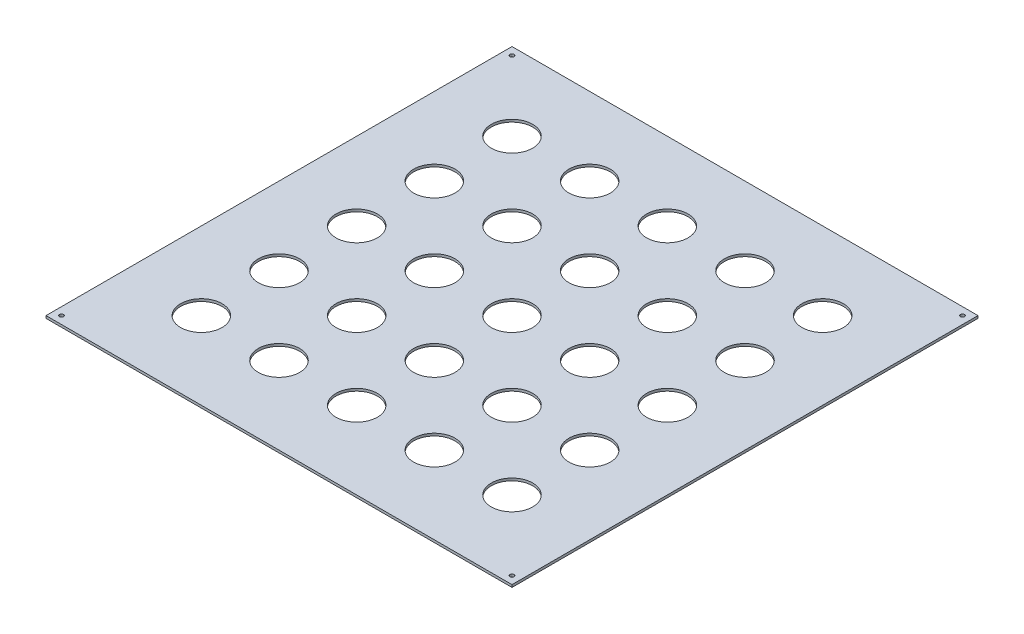
ISO-10303-21;
HEADER;
FILE_DESCRIPTION(('STEP AP214'),'2;1');
FILE_NAME('part.step','',(''),(''),'','','');
FILE_SCHEMA(('AUTOMOTIVE_DESIGN { 1 0 10303 214 1 1 1 1 }'));
ENDSEC;
DATA;
#1=APPLICATION_CONTEXT('core data for automotive mechanical design processes');
#2=APPLICATION_PROTOCOL_DEFINITION('international standard','automotive_design',2000,#1);
#3=PRODUCT_CONTEXT('',#1,'mechanical');
#4=PRODUCT('Part','Part','',(#3));
#5=PRODUCT_RELATED_PRODUCT_CATEGORY('part','',(#4));
#6=PRODUCT_DEFINITION_FORMATION('','',#4);
#7=PRODUCT_DEFINITION_CONTEXT('part definition',#1,'design');
#8=PRODUCT_DEFINITION('design','',#6,#7);
#9=PRODUCT_DEFINITION_SHAPE('','',#8);
#10=(LENGTH_UNIT() NAMED_UNIT(*) SI_UNIT(.MILLI.,.METRE.));
#11=(NAMED_UNIT(*) PLANE_ANGLE_UNIT() SI_UNIT($,.RADIAN.));
#12=(NAMED_UNIT(*) SI_UNIT($,.STERADIAN.) SOLID_ANGLE_UNIT());
#13=UNCERTAINTY_MEASURE_WITH_UNIT(LENGTH_MEASURE(1.E-05),#10,'distance_accuracy_value','');
#14=(GEOMETRIC_REPRESENTATION_CONTEXT(3) GLOBAL_UNCERTAINTY_ASSIGNED_CONTEXT((#13)) GLOBAL_UNIT_ASSIGNED_CONTEXT((#10,
#11,#12)) REPRESENTATION_CONTEXT('',''));
#15=CARTESIAN_POINT('',(0.,0.,0.));
#16=DIRECTION('',(0.,0.,1.));
#17=DIRECTION('',(1.,0.,0.));
#18=AXIS2_PLACEMENT_3D('',#15,#16,#17);
#19=CARTESIAN_POINT('',(300.000000000012,-1.5875,300.));
#20=DIRECTION('',(1.,0.,0.));
#21=DIRECTION('',(0.,0.,-1.));
#22=AXIS2_PLACEMENT_3D('',#19,#20,#21);
#23=PLANE('',#22);
#24=DIRECTION('',(0.,1.,0.));
#25=VECTOR('',#24,1.);
#26=CARTESIAN_POINT('',(300.000000000011,-1.5875,-300.));
#27=LINE('',#26,#25);
#28=CARTESIAN_POINT('',(300.000000000011,-1.5875,-300.));
#29=VERTEX_POINT('',#28);
#30=CARTESIAN_POINT('',(300.000000000011,1.5875,-300.));
#31=VERTEX_POINT('',#30);
#32=EDGE_CURVE('E36',#29,#31,#27,.T.);
#33=ORIENTED_EDGE('',*,*,#32,.T.);
#34=DIRECTION('',(0.,0.,-1.));
#35=VECTOR('',#34,1.);
#36=CARTESIAN_POINT('',(300.000000000012,1.5875,300.));
#37=LINE('',#36,#35);
#38=CARTESIAN_POINT('',(300.000000000012,1.5875,300.));
#39=VERTEX_POINT('',#38);
#40=EDGE_CURVE('E73',#39,#31,#37,.T.);
#41=ORIENTED_EDGE('',*,*,#40,.F.);
#42=DIRECTION('',(0.,1.,0.));
#43=VECTOR('',#42,1.);
#44=CARTESIAN_POINT('',(300.000000000012,-1.5875,300.));
#45=LINE('',#44,#43);
#46=CARTESIAN_POINT('',(300.000000000012,-1.5875,300.));
#47=VERTEX_POINT('',#46);
#48=EDGE_CURVE('E11',#47,#39,#45,.T.);
#49=ORIENTED_EDGE('',*,*,#48,.F.);
#50=DIRECTION('',(0.,0.,-1.));
#51=VECTOR('',#50,1.);
#52=CARTESIAN_POINT('',(300.000000000012,-1.5875,300.));
#53=LINE('',#52,#51);
#54=EDGE_CURVE('E74',#47,#29,#53,.T.);
#55=ORIENTED_EDGE('',*,*,#54,.T.);
#56=EDGE_LOOP('',(#33,#41,#49,#55));
#57=FACE_BOUND('',#56,.T.);
#58=ADVANCED_FACE('F33',(#57),#23,.T.);
#59=CARTESIAN_POINT('',(-300.000000000011,-1.5875,300.));
#60=DIRECTION('',(0.,0.,1.));
#61=DIRECTION('',(1.,0.,0.));
#62=AXIS2_PLACEMENT_3D('',#59,#60,#61);
#63=PLANE('',#62);
#64=ORIENTED_EDGE('',*,*,#48,.T.);
#65=DIRECTION('',(1.,0.,0.));
#66=VECTOR('',#65,1.);
#67=CARTESIAN_POINT('',(-300.000000000011,1.5875,300.));
#68=LINE('',#67,#66);
#69=CARTESIAN_POINT('',(-300.000000000011,1.5875,300.));
#70=VERTEX_POINT('',#69);
#71=EDGE_CURVE('E91',#70,#39,#68,.T.);
#72=ORIENTED_EDGE('',*,*,#71,.F.);
#73=DIRECTION('',(0.,1.,0.));
#74=VECTOR('',#73,1.);
#75=CARTESIAN_POINT('',(-300.000000000011,-1.5875,300.));
#76=LINE('',#75,#74);
#77=CARTESIAN_POINT('',(-300.000000000011,-1.5875,300.));
#78=VERTEX_POINT('',#77);
#79=EDGE_CURVE('E41',#78,#70,#76,.T.);
#80=ORIENTED_EDGE('',*,*,#79,.F.);
#81=DIRECTION('',(1.,0.,0.));
#82=VECTOR('',#81,1.);
#83=CARTESIAN_POINT('',(-300.000000000011,-1.5875,300.));
#84=LINE('',#83,#82);
#85=EDGE_CURVE('E79',#78,#47,#84,.T.);
#86=ORIENTED_EDGE('',*,*,#85,.T.);
#87=EDGE_LOOP('',(#64,#72,#80,#86));
#88=FACE_BOUND('',#87,.T.);
#89=ADVANCED_FACE('F198',(#88),#63,.T.);
#90=CARTESIAN_POINT('',(-300.000000000011,-1.5875,300.));
#91=DIRECTION('',(-1.,0.,0.));
#92=DIRECTION('',(0.,0.,1.));
#93=AXIS2_PLACEMENT_3D('',#90,#91,#92);
#94=PLANE('',#93);
#95=ORIENTED_EDGE('',*,*,#79,.T.);
#96=DIRECTION('',(0.,0.,1.));
#97=VECTOR('',#96,1.);
#98=CARTESIAN_POINT('',(-300.000000000011,1.5875,300.));
#99=LINE('',#98,#97);
#100=CARTESIAN_POINT('',(-300.000000000011,1.5875,-300.));
#101=VERTEX_POINT('',#100);
#102=EDGE_CURVE('E86',#101,#70,#99,.T.);
#103=ORIENTED_EDGE('',*,*,#102,.F.);
#104=DIRECTION('',(0.,1.,0.));
#105=VECTOR('',#104,1.);
#106=CARTESIAN_POINT('',(-300.000000000011,-1.5875,-300.));
#107=LINE('',#106,#105);
#108=CARTESIAN_POINT('',(-300.000000000011,-1.5875,-300.));
#109=VERTEX_POINT('',#108);
#110=EDGE_CURVE('E78',#109,#101,#107,.T.);
#111=ORIENTED_EDGE('',*,*,#110,.F.);
#112=DIRECTION('',(0.,0.,1.));
#113=VECTOR('',#112,1.);
#114=CARTESIAN_POINT('',(-300.000000000011,-1.5875,300.));
#115=LINE('',#114,#113);
#116=EDGE_CURVE('E191',#109,#78,#115,.T.);
#117=ORIENTED_EDGE('',*,*,#116,.T.);
#118=EDGE_LOOP('',(#95,#103,#111,#117));
#119=FACE_BOUND('',#118,.T.);
#120=ADVANCED_FACE('F195',(#119),#94,.T.);
#121=CARTESIAN_POINT('',(-300.000000000011,-1.5875,-300.));
#122=DIRECTION('',(0.,0.,-1.));
#123=DIRECTION('',(-1.,0.,0.));
#124=AXIS2_PLACEMENT_3D('',#121,#122,#123);
#125=PLANE('',#124);
#126=ORIENTED_EDGE('',*,*,#110,.T.);
#127=DIRECTION('',(-1.,0.,0.));
#128=VECTOR('',#127,1.);
#129=CARTESIAN_POINT('',(-300.000000000011,1.5875,-300.));
#130=LINE('',#129,#128);
#131=EDGE_CURVE('E81',#31,#101,#130,.T.);
#132=ORIENTED_EDGE('',*,*,#131,.F.);
#133=ORIENTED_EDGE('',*,*,#32,.F.);
#134=DIRECTION('',(-1.,0.,0.));
#135=VECTOR('',#134,1.);
#136=CARTESIAN_POINT('',(-300.000000000011,-1.5875,-300.));
#137=LINE('',#136,#135);
#138=EDGE_CURVE('E189',#29,#109,#137,.T.);
#139=ORIENTED_EDGE('',*,*,#138,.T.);
#140=EDGE_LOOP('',(#126,#132,#133,#139));
#141=FACE_BOUND('',#140,.T.);
#142=ADVANCED_FACE('F82',(#141),#125,.T.);
#143=CARTESIAN_POINT('',(0.,-1.5875,0.));
#144=DIRECTION('',(0.,-1.,0.));
#145=DIRECTION('',(0.,0.,-1.));
#146=AXIS2_PLACEMENT_3D('',#143,#144,#145);
#147=PLANE('',#146);
#148=CARTESIAN_POINT('',(-99.9999999999994,-1.5875,-99.9999999999999));
#149=DIRECTION('',(0.,1.,0.));
#150=DIRECTION('',(0.,0.,-1.));
#151=AXIS2_PLACEMENT_3D('',#148,#149,#150);
#152=CIRCLE('',#151,26.67);
#153=CARTESIAN_POINT('',(-99.9999999999994,-1.5875,-126.67));
#154=VERTEX_POINT('',#153);
#155=EDGE_CURVE('E101',#154,#154,#152,.T.);
#156=ORIENTED_EDGE('',*,*,#155,.T.);
#157=EDGE_LOOP('',(#156));
#158=FACE_BOUND('',#157,.T.);
#159=CARTESIAN_POINT('',(-199.999999999999,-1.5875,-99.9999999999999));
#160=DIRECTION('',(0.,1.,0.));
#161=DIRECTION('',(0.,0.,-1.));
#162=AXIS2_PLACEMENT_3D('',#159,#160,#161);
#163=CIRCLE('',#162,26.67);
#164=CARTESIAN_POINT('',(-199.999999999999,-1.5875,-126.67));
#165=VERTEX_POINT('',#164);
#166=EDGE_CURVE('E104',#165,#165,#163,.T.);
#167=ORIENTED_EDGE('',*,*,#166,.T.);
#168=EDGE_LOOP('',(#167));
#169=FACE_BOUND('',#168,.T.);
#170=CARTESIAN_POINT('',(-99.9999999999991,-1.5875,-200.));
#171=DIRECTION('',(0.,1.,0.));
#172=DIRECTION('',(0.,0.,-1.));
#173=AXIS2_PLACEMENT_3D('',#170,#171,#172);
#174=CIRCLE('',#173,26.67);
#175=CARTESIAN_POINT('',(-99.9999999999991,-1.5875,-226.67));
#176=VERTEX_POINT('',#175);
#177=EDGE_CURVE('E107',#176,#176,#174,.T.);
#178=ORIENTED_EDGE('',*,*,#177,.T.);
#179=EDGE_LOOP('',(#178));
#180=FACE_BOUND('',#179,.T.);
#181=CARTESIAN_POINT('',(-199.999999999999,-1.5875,-200.));
#182=DIRECTION('',(0.,1.,0.));
#183=DIRECTION('',(0.,0.,-1.));
#184=AXIS2_PLACEMENT_3D('',#181,#182,#183);
#185=CIRCLE('',#184,26.67);
#186=CARTESIAN_POINT('',(-199.999999999999,-1.5875,-226.67));
#187=VERTEX_POINT('',#186);
#188=EDGE_CURVE('E110',#187,#187,#185,.T.);
#189=ORIENTED_EDGE('',*,*,#188,.T.);
#190=EDGE_LOOP('',(#189));
#191=FACE_BOUND('',#190,.T.);
#192=CARTESIAN_POINT('',(99.9999999999994,-1.5875,99.9999999999999));
#193=DIRECTION('',(0.,1.,0.));
#194=DIRECTION('',(0.,0.,-1.));
#195=AXIS2_PLACEMENT_3D('',#192,#193,#194);
#196=CIRCLE('',#195,26.67);
#197=CARTESIAN_POINT('',(99.9999999999994,-1.5875,73.3299999999999));
#198=VERTEX_POINT('',#197);
#199=EDGE_CURVE('E113',#198,#198,#196,.T.);
#200=ORIENTED_EDGE('',*,*,#199,.T.);
#201=EDGE_LOOP('',(#200));
#202=FACE_BOUND('',#201,.T.);
#203=CARTESIAN_POINT('',(199.999999999999,-1.5875,99.9999999999999));
#204=DIRECTION('',(0.,1.,0.));
#205=DIRECTION('',(0.,0.,-1.));
#206=AXIS2_PLACEMENT_3D('',#203,#204,#205);
#207=CIRCLE('',#206,26.67);
#208=CARTESIAN_POINT('',(199.999999999999,-1.5875,73.3299999999999));
#209=VERTEX_POINT('',#208);
#210=EDGE_CURVE('E116',#209,#209,#207,.T.);
#211=ORIENTED_EDGE('',*,*,#210,.T.);
#212=EDGE_LOOP('',(#211));
#213=FACE_BOUND('',#212,.T.);
#214=CARTESIAN_POINT('',(99.9999999999991,-1.5875,200.));
#215=DIRECTION('',(0.,1.,0.));
#216=DIRECTION('',(0.,0.,-1.));
#217=AXIS2_PLACEMENT_3D('',#214,#215,#216);
#218=CIRCLE('',#217,26.67);
#219=CARTESIAN_POINT('',(99.9999999999991,-1.5875,173.33));
#220=VERTEX_POINT('',#219);
#221=EDGE_CURVE('E119',#220,#220,#218,.T.);
#222=ORIENTED_EDGE('',*,*,#221,.T.);
#223=EDGE_LOOP('',(#222));
#224=FACE_BOUND('',#223,.T.);
#225=CARTESIAN_POINT('',(1.87284419838085E-12,-1.5875,200.));
#226=DIRECTION('',(0.,1.,0.));
#227=DIRECTION('',(0.,0.,1.));
#228=AXIS2_PLACEMENT_3D('',#225,#226,#227);
#229=CIRCLE('',#228,26.67);
#230=CARTESIAN_POINT('',(1.87284419838085E-12,-1.5875,226.67));
#231=VERTEX_POINT('',#230);
#232=EDGE_CURVE('E122',#231,#231,#229,.T.);
#233=ORIENTED_EDGE('',*,*,#232,.T.);
#234=EDGE_LOOP('',(#233));
#235=FACE_BOUND('',#234,.T.);
#236=CARTESIAN_POINT('',(8.25399796727909E-13,-1.5875,100.));
#237=DIRECTION('',(0.,1.,0.));
#238=DIRECTION('',(0.,0.,1.));
#239=AXIS2_PLACEMENT_3D('',#236,#237,#238);
#240=CIRCLE('',#239,26.67);
#241=CARTESIAN_POINT('',(8.25399796727909E-13,-1.5875,126.67));
#242=VERTEX_POINT('',#241);
#243=EDGE_CURVE('E125',#242,#242,#240,.T.);
#244=ORIENTED_EDGE('',*,*,#243,.T.);
#245=EDGE_LOOP('',(#244));
#246=FACE_BOUND('',#245,.T.);
#247=CARTESIAN_POINT('',(-199.999999999998,-1.5875,200.000000000002));
#248=DIRECTION('',(0.,1.,0.));
#249=DIRECTION('',(0.,0.,1.));
#250=AXIS2_PLACEMENT_3D('',#247,#248,#249);
#251=CIRCLE('',#250,26.67);
#252=CARTESIAN_POINT('',(-199.999999999998,-1.5875,226.670000000002));
#253=VERTEX_POINT('',#252);
#254=EDGE_CURVE('E128',#253,#253,#251,.T.);
#255=ORIENTED_EDGE('',*,*,#254,.T.);
#256=EDGE_LOOP('',(#255));
#257=FACE_BOUND('',#256,.T.);
#258=CARTESIAN_POINT('',(-99.9999999999981,-1.5875,200.000000000001));
#259=DIRECTION('',(0.,1.,0.));
#260=DIRECTION('',(0.,0.,1.));
#261=AXIS2_PLACEMENT_3D('',#258,#259,#260);
#262=CIRCLE('',#261,26.67);
#263=CARTESIAN_POINT('',(-99.9999999999981,-1.5875,226.670000000001));
#264=VERTEX_POINT('',#263);
#265=EDGE_CURVE('E131',#264,#264,#262,.T.);
#266=ORIENTED_EDGE('',*,*,#265,.T.);
#267=EDGE_LOOP('',(#266));
#268=FACE_BOUND('',#267,.T.);
#269=CARTESIAN_POINT('',(-199.999999999999,-1.5875,100.000000000002));
#270=DIRECTION('',(0.,1.,0.));
#271=DIRECTION('',(0.,0.,1.));
#272=AXIS2_PLACEMENT_3D('',#269,#270,#271);
#273=CIRCLE('',#272,26.67);
#274=CARTESIAN_POINT('',(-199.999999999999,-1.5875,126.670000000002));
#275=VERTEX_POINT('',#274);
#276=EDGE_CURVE('E134',#275,#275,#273,.T.);
#277=ORIENTED_EDGE('',*,*,#276,.T.);
#278=EDGE_LOOP('',(#277));
#279=FACE_BOUND('',#278,.T.);
#280=CARTESIAN_POINT('',(-99.9999999999992,-1.5875,100.000000000001));
#281=DIRECTION('',(0.,1.,0.));
#282=DIRECTION('',(0.,0.,1.));
#283=AXIS2_PLACEMENT_3D('',#280,#281,#282);
#284=CIRCLE('',#283,26.67);
#285=CARTESIAN_POINT('',(-99.9999999999992,-1.5875,126.670000000001));
#286=VERTEX_POINT('',#285);
#287=EDGE_CURVE('E137',#286,#286,#284,.T.);
#288=ORIENTED_EDGE('',*,*,#287,.T.);
#289=EDGE_LOOP('',(#288));
#290=FACE_BOUND('',#289,.T.);
#291=CARTESIAN_POINT('',(-200.,-1.5875,1.50761483799977E-12));
#292=DIRECTION('',(0.,1.,0.));
#293=DIRECTION('',(0.,0.,1.));
#294=AXIS2_PLACEMENT_3D('',#291,#292,#293);
#295=CIRCLE('',#294,26.67);
#296=CARTESIAN_POINT('',(-200.,-1.5875,26.6700000000015));
#297=VERTEX_POINT('',#296);
#298=EDGE_CURVE('E140',#297,#297,#295,.T.);
#299=ORIENTED_EDGE('',*,*,#298,.T.);
#300=EDGE_LOOP('',(#299));
#301=FACE_BOUND('',#300,.T.);
#302=CARTESIAN_POINT('',(-100.,-1.5875,8.09318570231142E-13));
#303=DIRECTION('',(0.,1.,0.));
#304=DIRECTION('',(0.,0.,1.));
#305=AXIS2_PLACEMENT_3D('',#302,#303,#304);
#306=CIRCLE('',#305,26.67);
#307=CARTESIAN_POINT('',(-100.,-1.5875,26.6700000000008));
#308=VERTEX_POINT('',#307);
#309=EDGE_CURVE('E143',#308,#308,#306,.T.);
#310=ORIENTED_EDGE('',*,*,#309,.T.);
#311=EDGE_LOOP('',(#310));
#312=FACE_BOUND('',#311,.T.);
#313=CARTESIAN_POINT('',(-9.20340872693658E-13,-1.5875,-200.));
#314=DIRECTION('',(0.,1.,0.));
#315=DIRECTION('',(0.,0.,1.));
#316=AXIS2_PLACEMENT_3D('',#313,#314,#315);
#317=CIRCLE('',#316,26.67);
#318=CARTESIAN_POINT('',(-9.20340872693658E-13,-1.5875,-173.33));
#319=VERTEX_POINT('',#318);
#320=EDGE_CURVE('E146',#319,#319,#317,.T.);
#321=ORIENTED_EDGE('',*,*,#320,.T.);
#322=EDGE_LOOP('',(#321));
#323=FACE_BOUND('',#322,.T.);
#324=CARTESIAN_POINT('',(-5.71192738809345E-13,-1.5875,-99.9999999999999));
#325=DIRECTION('',(0.,1.,0.));
#326=DIRECTION('',(0.,0.,1.));
#327=AXIS2_PLACEMENT_3D('',#324,#325,#326);
#328=CIRCLE('',#327,26.67);
#329=CARTESIAN_POINT('',(-5.71192738809345E-13,-1.5875,-73.3299999999999));
#330=VERTEX_POINT('',#329);
#331=EDGE_CURVE('E149',#330,#330,#328,.T.);
#332=ORIENTED_EDGE('',*,*,#331,.T.);
#333=EDGE_LOOP('',(#332));
#334=FACE_BOUND('',#333,.T.);
#335=CARTESIAN_POINT('',(199.999999999999,-1.5875,-200.));
#336=DIRECTION('',(0.,1.,0.));
#337=DIRECTION('',(0.,0.,1.));
#338=AXIS2_PLACEMENT_3D('',#335,#336,#337);
#339=CIRCLE('',#338,26.67);
#340=CARTESIAN_POINT('',(199.999999999999,-1.5875,-173.33));
#341=VERTEX_POINT('',#340);
#342=EDGE_CURVE('E152',#341,#341,#339,.T.);
#343=ORIENTED_EDGE('',*,*,#342,.T.);
#344=EDGE_LOOP('',(#343));
#345=FACE_BOUND('',#344,.T.);
#346=CARTESIAN_POINT('',(99.9999999999991,-1.5875,-200.));
#347=DIRECTION('',(0.,1.,0.));
#348=DIRECTION('',(0.,0.,1.));
#349=AXIS2_PLACEMENT_3D('',#346,#347,#348);
#350=CIRCLE('',#349,26.67);
#351=CARTESIAN_POINT('',(99.9999999999991,-1.5875,-173.33));
#352=VERTEX_POINT('',#351);
#353=EDGE_CURVE('E155',#352,#352,#350,.T.);
#354=ORIENTED_EDGE('',*,*,#353,.T.);
#355=EDGE_LOOP('',(#354));
#356=FACE_BOUND('',#355,.T.);
#357=CARTESIAN_POINT('',(199.999999999999,-1.5875,-99.9999999999999));
#358=DIRECTION('',(0.,1.,0.));
#359=DIRECTION('',(0.,0.,1.));
#360=AXIS2_PLACEMENT_3D('',#357,#358,#359);
#361=CIRCLE('',#360,26.67);
#362=CARTESIAN_POINT('',(199.999999999999,-1.5875,-73.3299999999999));
#363=VERTEX_POINT('',#362);
#364=EDGE_CURVE('E158',#363,#363,#361,.T.);
#365=ORIENTED_EDGE('',*,*,#364,.T.);
#366=EDGE_LOOP('',(#365));
#367=FACE_BOUND('',#366,.T.);
#368=CARTESIAN_POINT('',(99.9999999999994,-1.5875,-99.9999999999999));
#369=DIRECTION('',(0.,1.,0.));
#370=DIRECTION('',(0.,0.,1.));
#371=AXIS2_PLACEMENT_3D('',#368,#369,#370);
#372=CIRCLE('',#371,26.67);
#373=CARTESIAN_POINT('',(99.9999999999994,-1.5875,-73.3299999999999));
#374=VERTEX_POINT('',#373);
#375=EDGE_CURVE('E161',#374,#374,#372,.T.);
#376=ORIENTED_EDGE('',*,*,#375,.T.);
#377=EDGE_LOOP('',(#376));
#378=FACE_BOUND('',#377,.T.);
#379=CARTESIAN_POINT('',(200.,-1.5875,1.11022302462516E-13));
#380=DIRECTION('',(0.,1.,0.));
#381=DIRECTION('',(0.,0.,1.));
#382=AXIS2_PLACEMENT_3D('',#379,#380,#381);
#383=CIRCLE('',#382,26.67);
#384=CARTESIAN_POINT('',(200.,-1.5875,26.6700000000001));
#385=VERTEX_POINT('',#384);
#386=EDGE_CURVE('E164',#385,#385,#383,.T.);
#387=ORIENTED_EDGE('',*,*,#386,.T.);
#388=EDGE_LOOP('',(#387));
#389=FACE_BOUND('',#388,.T.);
#390=CARTESIAN_POINT('',(99.9999999999998,-1.5875,1.11022302462516E-13));
#391=DIRECTION('',(0.,1.,0.));
#392=DIRECTION('',(0.,0.,1.));
#393=AXIS2_PLACEMENT_3D('',#390,#391,#392);
#394=CIRCLE('',#393,26.67);
#395=CARTESIAN_POINT('',(99.9999999999998,-1.5875,26.6700000000001));
#396=VERTEX_POINT('',#395);
#397=EDGE_CURVE('E167',#396,#396,#394,.T.);
#398=ORIENTED_EDGE('',*,*,#397,.T.);
#399=EDGE_LOOP('',(#398));
#400=FACE_BOUND('',#399,.T.);
#401=CARTESIAN_POINT('',(-2.22044604925031E-13,-1.5875,1.11022302462516E-13));
#402=DIRECTION('',(0.,1.,0.));
#403=DIRECTION('',(0.,0.,1.));
#404=AXIS2_PLACEMENT_3D('',#401,#402,#403);
#405=CIRCLE('',#404,26.67);
#406=CARTESIAN_POINT('',(-2.22044604925031E-13,-1.5875,26.6700000000001));
#407=VERTEX_POINT('',#406);
#408=EDGE_CURVE('E170',#407,#407,#405,.T.);
#409=ORIENTED_EDGE('',*,*,#408,.T.);
#410=EDGE_LOOP('',(#409));
#411=FACE_BOUND('',#410,.T.);
#412=CARTESIAN_POINT('',(199.999999999999,-1.5875,200.));
#413=DIRECTION('',(0.,1.,0.));
#414=DIRECTION('',(0.,0.,-1.));
#415=AXIS2_PLACEMENT_3D('',#412,#413,#414);
#416=CIRCLE('',#415,26.67);
#417=CARTESIAN_POINT('',(199.999999999999,-1.5875,173.33));
#418=VERTEX_POINT('',#417);
#419=EDGE_CURVE('E173',#418,#418,#416,.T.);
#420=ORIENTED_EDGE('',*,*,#419,.T.);
#421=EDGE_LOOP('',(#420));
#422=FACE_BOUND('',#421,.T.);
#423=CARTESIAN_POINT('',(-290.000000000011,-1.5875,290.));
#424=DIRECTION('',(0.,1.,0.));
#425=DIRECTION('',(0.,0.,-1.));
#426=AXIS2_PLACEMENT_3D('',#423,#424,#425);
#427=CIRCLE('',#426,2.60000000000001);
#428=CARTESIAN_POINT('',(-290.000000000011,-1.5875,287.4));
#429=VERTEX_POINT('',#428);
#430=EDGE_CURVE('E176',#429,#429,#427,.T.);
#431=ORIENTED_EDGE('',*,*,#430,.T.);
#432=EDGE_LOOP('',(#431));
#433=FACE_BOUND('',#432,.T.);
#434=CARTESIAN_POINT('',(290.000000000011,-1.5875,290.));
#435=DIRECTION('',(0.,1.,0.));
#436=DIRECTION('',(0.,0.,1.));
#437=AXIS2_PLACEMENT_3D('',#434,#435,#436);
#438=CIRCLE('',#437,2.60000000000001);
#439=CARTESIAN_POINT('',(290.000000000011,-1.5875,292.6));
#440=VERTEX_POINT('',#439);
#441=EDGE_CURVE('E179',#440,#440,#438,.T.);
#442=ORIENTED_EDGE('',*,*,#441,.T.);
#443=EDGE_LOOP('',(#442));
#444=FACE_BOUND('',#443,.T.);
#445=CARTESIAN_POINT('',(290.000000000011,-1.5875,-290.));
#446=DIRECTION('',(0.,1.,0.));
#447=DIRECTION('',(0.,0.,-1.));
#448=AXIS2_PLACEMENT_3D('',#445,#446,#447);
#449=CIRCLE('',#448,2.60000000000001);
#450=CARTESIAN_POINT('',(290.000000000011,-1.5875,-292.6));
#451=VERTEX_POINT('',#450);
#452=EDGE_CURVE('E182',#451,#451,#449,.T.);
#453=ORIENTED_EDGE('',*,*,#452,.T.);
#454=EDGE_LOOP('',(#453));
#455=FACE_BOUND('',#454,.T.);
#456=CARTESIAN_POINT('',(-290.000000000011,-1.5875,-290.));
#457=DIRECTION('',(0.,1.,0.));
#458=DIRECTION('',(0.,0.,1.));
#459=AXIS2_PLACEMENT_3D('',#456,#457,#458);
#460=CIRCLE('',#459,2.60000000000001);
#461=CARTESIAN_POINT('',(-290.000000000011,-1.5875,-287.4));
#462=VERTEX_POINT('',#461);
#463=EDGE_CURVE('E185',#462,#462,#460,.T.);
#464=ORIENTED_EDGE('',*,*,#463,.T.);
#465=EDGE_LOOP('',(#464));
#466=FACE_BOUND('',#465,.T.);
#467=ORIENTED_EDGE('',*,*,#54,.F.);
#468=ORIENTED_EDGE('',*,*,#85,.F.);
#469=ORIENTED_EDGE('',*,*,#116,.F.);
#470=ORIENTED_EDGE('',*,*,#138,.F.);
#471=EDGE_LOOP('',(#467,#468,#469,#470));
#472=FACE_BOUND('',#471,.T.);
#473=ADVANCED_FACE('F200',(#158,#169,#180,#191,#202,#213,#224,#235,#246,#257,#268,#279,#290,
#301,#312,#323,#334,#345,#356,#367,#378,#389,#400,#411,#422,#433,#444,#455,#466,#472),#147,.T.);
#474=CARTESIAN_POINT('',(-290.000000000011,-1.5875,-290.));
#475=DIRECTION('',(0.,1.,0.));
#476=DIRECTION('',(0.,0.,1.));
#477=AXIS2_PLACEMENT_3D('',#474,#475,#476);
#478=CYLINDRICAL_SURFACE('',#477,2.60000000000001);
#479=ORIENTED_EDGE('',*,*,#463,.F.);
#480=EDGE_LOOP('',(#479));
#481=FACE_BOUND('',#480,.T.);
#482=CARTESIAN_POINT('',(-290.000000000011,1.5875,-290.));
#483=DIRECTION('',(0.,1.,0.));
#484=DIRECTION('',(0.,0.,1.));
#485=AXIS2_PLACEMENT_3D('',#482,#483,#484);
#486=CIRCLE('',#485,2.60000000000001);
#487=CARTESIAN_POINT('',(-290.000000000011,1.5875,-287.4));
#488=VERTEX_POINT('',#487);
#489=EDGE_CURVE('E92',#488,#488,#486,.T.);
#490=ORIENTED_EDGE('',*,*,#489,.T.);
#491=EDGE_LOOP('',(#490));
#492=FACE_BOUND('',#491,.T.);
#493=ADVANCED_FACE('F202',(#481,#492),#478,.F.);
#494=CARTESIAN_POINT('',(290.000000000011,-1.5875,-290.));
#495=DIRECTION('',(0.,1.,0.));
#496=DIRECTION('',(0.,0.,1.));
#497=AXIS2_PLACEMENT_3D('',#494,#495,#496);
#498=CYLINDRICAL_SURFACE('',#497,2.60000000000001);
#499=ORIENTED_EDGE('',*,*,#452,.F.);
#500=EDGE_LOOP('',(#499));
#501=FACE_BOUND('',#500,.T.);
#502=CARTESIAN_POINT('',(290.000000000011,1.5875,-290.));
#503=DIRECTION('',(0.,1.,0.));
#504=DIRECTION('',(0.,0.,-1.));
#505=AXIS2_PLACEMENT_3D('',#502,#503,#504);
#506=CIRCLE('',#505,2.60000000000001);
#507=CARTESIAN_POINT('',(290.000000000011,1.5875,-292.6));
#508=VERTEX_POINT('',#507);
#509=EDGE_CURVE('E95',#508,#508,#506,.T.);
#510=ORIENTED_EDGE('',*,*,#509,.T.);
#511=EDGE_LOOP('',(#510));
#512=FACE_BOUND('',#511,.T.);
#513=ADVANCED_FACE('F209',(#501,#512),#498,.F.);
#514=CARTESIAN_POINT('',(290.000000000011,-1.5875,290.));
#515=DIRECTION('',(0.,1.,0.));
#516=DIRECTION('',(0.,0.,1.));
#517=AXIS2_PLACEMENT_3D('',#514,#515,#516);
#518=CYLINDRICAL_SURFACE('',#517,2.60000000000001);
#519=ORIENTED_EDGE('',*,*,#441,.F.);
#520=EDGE_LOOP('',(#519));
#521=FACE_BOUND('',#520,.T.);
#522=CARTESIAN_POINT('',(290.000000000011,1.5875,290.));
#523=DIRECTION('',(0.,1.,0.));
#524=DIRECTION('',(0.,0.,1.));
#525=AXIS2_PLACEMENT_3D('',#522,#523,#524);
#526=CIRCLE('',#525,2.60000000000001);
#527=CARTESIAN_POINT('',(290.000000000011,1.5875,292.6));
#528=VERTEX_POINT('',#527);
#529=EDGE_CURVE('E612',#528,#528,#526,.T.);
#530=ORIENTED_EDGE('',*,*,#529,.T.);
#531=EDGE_LOOP('',(#530));
#532=FACE_BOUND('',#531,.T.);
#533=ADVANCED_FACE('F247',(#521,#532),#518,.F.);
#534=CARTESIAN_POINT('',(-290.000000000011,-1.5875,290.));
#535=DIRECTION('',(0.,1.,0.));
#536=DIRECTION('',(0.,0.,1.));
#537=AXIS2_PLACEMENT_3D('',#534,#535,#536);
#538=CYLINDRICAL_SURFACE('',#537,2.60000000000001);
#539=ORIENTED_EDGE('',*,*,#430,.F.);
#540=EDGE_LOOP('',(#539));
#541=FACE_BOUND('',#540,.T.);
#542=CARTESIAN_POINT('',(-290.000000000011,1.5875,290.));
#543=DIRECTION('',(0.,1.,0.));
#544=DIRECTION('',(0.,0.,-1.));
#545=AXIS2_PLACEMENT_3D('',#542,#543,#544);
#546=CIRCLE('',#545,2.60000000000001);
#547=CARTESIAN_POINT('',(-290.000000000011,1.5875,287.4));
#548=VERTEX_POINT('',#547);
#549=EDGE_CURVE('E609',#548,#548,#546,.T.);
#550=ORIENTED_EDGE('',*,*,#549,.T.);
#551=EDGE_LOOP('',(#550));
#552=FACE_BOUND('',#551,.T.);
#553=ADVANCED_FACE('F257',(#541,#552),#538,.F.);
#554=CARTESIAN_POINT('',(199.999999999999,-1.5875,200.));
#555=DIRECTION('',(0.,1.,0.));
#556=DIRECTION('',(0.,0.,1.));
#557=AXIS2_PLACEMENT_3D('',#554,#555,#556);
#558=CYLINDRICAL_SURFACE('',#557,26.67);
#559=ORIENTED_EDGE('',*,*,#419,.F.);
#560=EDGE_LOOP('',(#559));
#561=FACE_BOUND('',#560,.T.);
#562=CARTESIAN_POINT('',(199.999999999999,1.5875,200.));
#563=DIRECTION('',(0.,1.,0.));
#564=DIRECTION('',(0.,0.,-1.));
#565=AXIS2_PLACEMENT_3D('',#562,#563,#564);
#566=CIRCLE('',#565,26.67);
#567=CARTESIAN_POINT('',(199.999999999999,1.5875,173.33));
#568=VERTEX_POINT('',#567);
#569=EDGE_CURVE('E606',#568,#568,#566,.T.);
#570=ORIENTED_EDGE('',*,*,#569,.T.);
#571=EDGE_LOOP('',(#570));
#572=FACE_BOUND('',#571,.T.);
#573=ADVANCED_FACE('F267',(#561,#572),#558,.F.);
#574=CARTESIAN_POINT('',(-2.22044604925031E-13,-1.5875,1.11022302462516E-13));
#575=DIRECTION('',(0.,1.,0.));
#576=DIRECTION('',(0.,0.,1.));
#577=AXIS2_PLACEMENT_3D('',#574,#575,#576);
#578=CYLINDRICAL_SURFACE('',#577,26.67);
#579=ORIENTED_EDGE('',*,*,#408,.F.);
#580=EDGE_LOOP('',(#579));
#581=FACE_BOUND('',#580,.T.);
#582=CARTESIAN_POINT('',(-2.22044604925031E-13,1.5875,1.11022302462516E-13));
#583=DIRECTION('',(0.,1.,0.));
#584=DIRECTION('',(0.,0.,1.));
#585=AXIS2_PLACEMENT_3D('',#582,#583,#584);
#586=CIRCLE('',#585,26.67);
#587=CARTESIAN_POINT('',(-2.22044604925031E-13,1.5875,26.6700000000001));
#588=VERTEX_POINT('',#587);
#589=EDGE_CURVE('E603',#588,#588,#586,.T.);
#590=ORIENTED_EDGE('',*,*,#589,.T.);
#591=EDGE_LOOP('',(#590));
#592=FACE_BOUND('',#591,.T.);
#593=ADVANCED_FACE('F277',(#581,#592),#578,.F.);
#594=CARTESIAN_POINT('',(99.9999999999998,-1.5875,1.11022302462516E-13));
#595=DIRECTION('',(0.,1.,0.));
#596=DIRECTION('',(0.,0.,1.));
#597=AXIS2_PLACEMENT_3D('',#594,#595,#596);
#598=CYLINDRICAL_SURFACE('',#597,26.67);
#599=ORIENTED_EDGE('',*,*,#397,.F.);
#600=EDGE_LOOP('',(#599));
#601=FACE_BOUND('',#600,.T.);
#602=CARTESIAN_POINT('',(99.9999999999998,1.5875,1.11022302462516E-13));
#603=DIRECTION('',(0.,1.,0.));
#604=DIRECTION('',(0.,0.,1.));
#605=AXIS2_PLACEMENT_3D('',#602,#603,#604);
#606=CIRCLE('',#605,26.67);
#607=CARTESIAN_POINT('',(99.9999999999998,1.5875,26.6700000000001));
#608=VERTEX_POINT('',#607);
#609=EDGE_CURVE('E600',#608,#608,#606,.T.);
#610=ORIENTED_EDGE('',*,*,#609,.T.);
#611=EDGE_LOOP('',(#610));
#612=FACE_BOUND('',#611,.T.);
#613=ADVANCED_FACE('F287',(#601,#612),#598,.F.);
#614=CARTESIAN_POINT('',(200.,-1.5875,1.11022302462516E-13));
#615=DIRECTION('',(0.,1.,0.));
#616=DIRECTION('',(0.,0.,1.));
#617=AXIS2_PLACEMENT_3D('',#614,#615,#616);
#618=CYLINDRICAL_SURFACE('',#617,26.67);
#619=ORIENTED_EDGE('',*,*,#386,.F.);
#620=EDGE_LOOP('',(#619));
#621=FACE_BOUND('',#620,.T.);
#622=CARTESIAN_POINT('',(200.,1.5875,1.11022302462516E-13));
#623=DIRECTION('',(0.,1.,0.));
#624=DIRECTION('',(0.,0.,1.));
#625=AXIS2_PLACEMENT_3D('',#622,#623,#624);
#626=CIRCLE('',#625,26.67);
#627=CARTESIAN_POINT('',(200.,1.5875,26.6700000000001));
#628=VERTEX_POINT('',#627);
#629=EDGE_CURVE('E597',#628,#628,#626,.T.);
#630=ORIENTED_EDGE('',*,*,#629,.T.);
#631=EDGE_LOOP('',(#630));
#632=FACE_BOUND('',#631,.T.);
#633=ADVANCED_FACE('F297',(#621,#632),#618,.F.);
#634=CARTESIAN_POINT('',(99.9999999999994,-1.5875,-99.9999999999999));
#635=DIRECTION('',(0.,1.,0.));
#636=DIRECTION('',(0.,0.,1.));
#637=AXIS2_PLACEMENT_3D('',#634,#635,#636);
#638=CYLINDRICAL_SURFACE('',#637,26.67);
#639=ORIENTED_EDGE('',*,*,#375,.F.);
#640=EDGE_LOOP('',(#639));
#641=FACE_BOUND('',#640,.T.);
#642=CARTESIAN_POINT('',(99.9999999999994,1.5875,-99.9999999999999));
#643=DIRECTION('',(0.,1.,0.));
#644=DIRECTION('',(0.,0.,1.));
#645=AXIS2_PLACEMENT_3D('',#642,#643,#644);
#646=CIRCLE('',#645,26.67);
#647=CARTESIAN_POINT('',(99.9999999999994,1.5875,-73.3299999999999));
#648=VERTEX_POINT('',#647);
#649=EDGE_CURVE('E594',#648,#648,#646,.T.);
#650=ORIENTED_EDGE('',*,*,#649,.T.);
#651=EDGE_LOOP('',(#650));
#652=FACE_BOUND('',#651,.T.);
#653=ADVANCED_FACE('F307',(#641,#652),#638,.F.);
#654=CARTESIAN_POINT('',(199.999999999999,-1.5875,-99.9999999999999));
#655=DIRECTION('',(0.,1.,0.));
#656=DIRECTION('',(0.,0.,1.));
#657=AXIS2_PLACEMENT_3D('',#654,#655,#656);
#658=CYLINDRICAL_SURFACE('',#657,26.67);
#659=ORIENTED_EDGE('',*,*,#364,.F.);
#660=EDGE_LOOP('',(#659));
#661=FACE_BOUND('',#660,.T.);
#662=CARTESIAN_POINT('',(199.999999999999,1.5875,-99.9999999999999));
#663=DIRECTION('',(0.,1.,0.));
#664=DIRECTION('',(0.,0.,1.));
#665=AXIS2_PLACEMENT_3D('',#662,#663,#664);
#666=CIRCLE('',#665,26.67);
#667=CARTESIAN_POINT('',(199.999999999999,1.5875,-73.3299999999999));
#668=VERTEX_POINT('',#667);
#669=EDGE_CURVE('E591',#668,#668,#666,.T.);
#670=ORIENTED_EDGE('',*,*,#669,.T.);
#671=EDGE_LOOP('',(#670));
#672=FACE_BOUND('',#671,.T.);
#673=ADVANCED_FACE('F317',(#661,#672),#658,.F.);
#674=CARTESIAN_POINT('',(99.9999999999991,-1.5875,-200.));
#675=DIRECTION('',(0.,1.,0.));
#676=DIRECTION('',(0.,0.,1.));
#677=AXIS2_PLACEMENT_3D('',#674,#675,#676);
#678=CYLINDRICAL_SURFACE('',#677,26.67);
#679=ORIENTED_EDGE('',*,*,#353,.F.);
#680=EDGE_LOOP('',(#679));
#681=FACE_BOUND('',#680,.T.);
#682=CARTESIAN_POINT('',(99.9999999999991,1.5875,-200.));
#683=DIRECTION('',(0.,1.,0.));
#684=DIRECTION('',(0.,0.,1.));
#685=AXIS2_PLACEMENT_3D('',#682,#683,#684);
#686=CIRCLE('',#685,26.67);
#687=CARTESIAN_POINT('',(99.9999999999991,1.5875,-173.33));
#688=VERTEX_POINT('',#687);
#689=EDGE_CURVE('E588',#688,#688,#686,.T.);
#690=ORIENTED_EDGE('',*,*,#689,.T.);
#691=EDGE_LOOP('',(#690));
#692=FACE_BOUND('',#691,.T.);
#693=ADVANCED_FACE('F327',(#681,#692),#678,.F.);
#694=CARTESIAN_POINT('',(199.999999999999,-1.5875,-200.));
#695=DIRECTION('',(0.,1.,0.));
#696=DIRECTION('',(0.,0.,1.));
#697=AXIS2_PLACEMENT_3D('',#694,#695,#696);
#698=CYLINDRICAL_SURFACE('',#697,26.67);
#699=ORIENTED_EDGE('',*,*,#342,.F.);
#700=EDGE_LOOP('',(#699));
#701=FACE_BOUND('',#700,.T.);
#702=CARTESIAN_POINT('',(199.999999999999,1.5875,-200.));
#703=DIRECTION('',(0.,1.,0.));
#704=DIRECTION('',(0.,0.,1.));
#705=AXIS2_PLACEMENT_3D('',#702,#703,#704);
#706=CIRCLE('',#705,26.67);
#707=CARTESIAN_POINT('',(199.999999999999,1.5875,-173.33));
#708=VERTEX_POINT('',#707);
#709=EDGE_CURVE('E585',#708,#708,#706,.T.);
#710=ORIENTED_EDGE('',*,*,#709,.T.);
#711=EDGE_LOOP('',(#710));
#712=FACE_BOUND('',#711,.T.);
#713=ADVANCED_FACE('F337',(#701,#712),#698,.F.);
#714=CARTESIAN_POINT('',(-5.71192738809345E-13,-1.5875,-99.9999999999999));
#715=DIRECTION('',(0.,1.,0.));
#716=DIRECTION('',(0.,0.,1.));
#717=AXIS2_PLACEMENT_3D('',#714,#715,#716);
#718=CYLINDRICAL_SURFACE('',#717,26.67);
#719=ORIENTED_EDGE('',*,*,#331,.F.);
#720=EDGE_LOOP('',(#719));
#721=FACE_BOUND('',#720,.T.);
#722=CARTESIAN_POINT('',(-5.71192738809345E-13,1.5875,-99.9999999999999));
#723=DIRECTION('',(0.,1.,0.));
#724=DIRECTION('',(0.,0.,1.));
#725=AXIS2_PLACEMENT_3D('',#722,#723,#724);
#726=CIRCLE('',#725,26.67);
#727=CARTESIAN_POINT('',(-5.71192738809345E-13,1.5875,-73.3299999999999));
#728=VERTEX_POINT('',#727);
#729=EDGE_CURVE('E582',#728,#728,#726,.T.);
#730=ORIENTED_EDGE('',*,*,#729,.T.);
#731=EDGE_LOOP('',(#730));
#732=FACE_BOUND('',#731,.T.);
#733=ADVANCED_FACE('F347',(#721,#732),#718,.F.);
#734=CARTESIAN_POINT('',(-9.20340872693658E-13,-1.5875,-200.));
#735=DIRECTION('',(0.,1.,0.));
#736=DIRECTION('',(0.,0.,1.));
#737=AXIS2_PLACEMENT_3D('',#734,#735,#736);
#738=CYLINDRICAL_SURFACE('',#737,26.67);
#739=ORIENTED_EDGE('',*,*,#320,.F.);
#740=EDGE_LOOP('',(#739));
#741=FACE_BOUND('',#740,.T.);
#742=CARTESIAN_POINT('',(-9.20340872693658E-13,1.5875,-200.));
#743=DIRECTION('',(0.,1.,0.));
#744=DIRECTION('',(0.,0.,1.));
#745=AXIS2_PLACEMENT_3D('',#742,#743,#744);
#746=CIRCLE('',#745,26.67);
#747=CARTESIAN_POINT('',(-9.20340872693658E-13,1.5875,-173.33));
#748=VERTEX_POINT('',#747);
#749=EDGE_CURVE('E579',#748,#748,#746,.T.);
#750=ORIENTED_EDGE('',*,*,#749,.T.);
#751=EDGE_LOOP('',(#750));
#752=FACE_BOUND('',#751,.T.);
#753=ADVANCED_FACE('F357',(#741,#752),#738,.F.);
#754=CARTESIAN_POINT('',(-100.,-1.5875,8.09318570231142E-13));
#755=DIRECTION('',(0.,1.,0.));
#756=DIRECTION('',(0.,0.,1.));
#757=AXIS2_PLACEMENT_3D('',#754,#755,#756);
#758=CYLINDRICAL_SURFACE('',#757,26.67);
#759=ORIENTED_EDGE('',*,*,#309,.F.);
#760=EDGE_LOOP('',(#759));
#761=FACE_BOUND('',#760,.T.);
#762=CARTESIAN_POINT('',(-100.,1.5875,8.09318570231142E-13));
#763=DIRECTION('',(0.,1.,0.));
#764=DIRECTION('',(0.,0.,1.));
#765=AXIS2_PLACEMENT_3D('',#762,#763,#764);
#766=CIRCLE('',#765,26.67);
#767=CARTESIAN_POINT('',(-100.,1.5875,26.6700000000008));
#768=VERTEX_POINT('',#767);
#769=EDGE_CURVE('E576',#768,#768,#766,.T.);
#770=ORIENTED_EDGE('',*,*,#769,.T.);
#771=EDGE_LOOP('',(#770));
#772=FACE_BOUND('',#771,.T.);
#773=ADVANCED_FACE('F367',(#761,#772),#758,.F.);
#774=CARTESIAN_POINT('',(-200.,-1.5875,1.50761483799977E-12));
#775=DIRECTION('',(0.,1.,0.));
#776=DIRECTION('',(0.,0.,1.));
#777=AXIS2_PLACEMENT_3D('',#774,#775,#776);
#778=CYLINDRICAL_SURFACE('',#777,26.67);
#779=ORIENTED_EDGE('',*,*,#298,.F.);
#780=EDGE_LOOP('',(#779));
#781=FACE_BOUND('',#780,.T.);
#782=CARTESIAN_POINT('',(-200.,1.5875,1.50761483799977E-12));
#783=DIRECTION('',(0.,1.,0.));
#784=DIRECTION('',(0.,0.,1.));
#785=AXIS2_PLACEMENT_3D('',#782,#783,#784);
#786=CIRCLE('',#785,26.67);
#787=CARTESIAN_POINT('',(-200.,1.5875,26.6700000000015));
#788=VERTEX_POINT('',#787);
#789=EDGE_CURVE('E573',#788,#788,#786,.T.);
#790=ORIENTED_EDGE('',*,*,#789,.T.);
#791=EDGE_LOOP('',(#790));
#792=FACE_BOUND('',#791,.T.);
#793=ADVANCED_FACE('F377',(#781,#792),#778,.F.);
#794=CARTESIAN_POINT('',(-99.9999999999992,-1.5875,100.000000000001));
#795=DIRECTION('',(0.,1.,0.));
#796=DIRECTION('',(0.,0.,1.));
#797=AXIS2_PLACEMENT_3D('',#794,#795,#796);
#798=CYLINDRICAL_SURFACE('',#797,26.67);
#799=ORIENTED_EDGE('',*,*,#287,.F.);
#800=EDGE_LOOP('',(#799));
#801=FACE_BOUND('',#800,.T.);
#802=CARTESIAN_POINT('',(-99.9999999999992,1.5875,100.000000000001));
#803=DIRECTION('',(0.,1.,0.));
#804=DIRECTION('',(0.,0.,1.));
#805=AXIS2_PLACEMENT_3D('',#802,#803,#804);
#806=CIRCLE('',#805,26.67);
#807=CARTESIAN_POINT('',(-99.9999999999992,1.5875,126.670000000001));
#808=VERTEX_POINT('',#807);
#809=EDGE_CURVE('E570',#808,#808,#806,.T.);
#810=ORIENTED_EDGE('',*,*,#809,.T.);
#811=EDGE_LOOP('',(#810));
#812=FACE_BOUND('',#811,.T.);
#813=ADVANCED_FACE('F387',(#801,#812),#798,.F.);
#814=CARTESIAN_POINT('',(-199.999999999999,-1.5875,100.000000000002));
#815=DIRECTION('',(0.,1.,0.));
#816=DIRECTION('',(0.,0.,1.));
#817=AXIS2_PLACEMENT_3D('',#814,#815,#816);
#818=CYLINDRICAL_SURFACE('',#817,26.67);
#819=ORIENTED_EDGE('',*,*,#276,.F.);
#820=EDGE_LOOP('',(#819));
#821=FACE_BOUND('',#820,.T.);
#822=CARTESIAN_POINT('',(-199.999999999999,1.5875,100.000000000002));
#823=DIRECTION('',(0.,1.,0.));
#824=DIRECTION('',(0.,0.,1.));
#825=AXIS2_PLACEMENT_3D('',#822,#823,#824);
#826=CIRCLE('',#825,26.67);
#827=CARTESIAN_POINT('',(-199.999999999999,1.5875,126.670000000002));
#828=VERTEX_POINT('',#827);
#829=EDGE_CURVE('E567',#828,#828,#826,.T.);
#830=ORIENTED_EDGE('',*,*,#829,.T.);
#831=EDGE_LOOP('',(#830));
#832=FACE_BOUND('',#831,.T.);
#833=ADVANCED_FACE('F397',(#821,#832),#818,.F.);
#834=CARTESIAN_POINT('',(-99.9999999999981,-1.5875,200.000000000001));
#835=DIRECTION('',(0.,1.,0.));
#836=DIRECTION('',(0.,0.,1.));
#837=AXIS2_PLACEMENT_3D('',#834,#835,#836);
#838=CYLINDRICAL_SURFACE('',#837,26.67);
#839=ORIENTED_EDGE('',*,*,#265,.F.);
#840=EDGE_LOOP('',(#839));
#841=FACE_BOUND('',#840,.T.);
#842=CARTESIAN_POINT('',(-99.9999999999981,1.5875,200.000000000001));
#843=DIRECTION('',(0.,1.,0.));
#844=DIRECTION('',(0.,0.,1.));
#845=AXIS2_PLACEMENT_3D('',#842,#843,#844);
#846=CIRCLE('',#845,26.67);
#847=CARTESIAN_POINT('',(-99.9999999999981,1.5875,226.670000000001));
#848=VERTEX_POINT('',#847);
#849=EDGE_CURVE('E564',#848,#848,#846,.T.);
#850=ORIENTED_EDGE('',*,*,#849,.T.);
#851=EDGE_LOOP('',(#850));
#852=FACE_BOUND('',#851,.T.);
#853=ADVANCED_FACE('F407',(#841,#852),#838,.F.);
#854=CARTESIAN_POINT('',(-199.999999999998,-1.5875,200.000000000002));
#855=DIRECTION('',(0.,1.,0.));
#856=DIRECTION('',(0.,0.,1.));
#857=AXIS2_PLACEMENT_3D('',#854,#855,#856);
#858=CYLINDRICAL_SURFACE('',#857,26.67);
#859=ORIENTED_EDGE('',*,*,#254,.F.);
#860=EDGE_LOOP('',(#859));
#861=FACE_BOUND('',#860,.T.);
#862=CARTESIAN_POINT('',(-199.999999999998,1.5875,200.000000000002));
#863=DIRECTION('',(0.,1.,0.));
#864=DIRECTION('',(0.,0.,1.));
#865=AXIS2_PLACEMENT_3D('',#862,#863,#864);
#866=CIRCLE('',#865,26.67);
#867=CARTESIAN_POINT('',(-199.999999999998,1.5875,226.670000000002));
#868=VERTEX_POINT('',#867);
#869=EDGE_CURVE('E561',#868,#868,#866,.T.);
#870=ORIENTED_EDGE('',*,*,#869,.T.);
#871=EDGE_LOOP('',(#870));
#872=FACE_BOUND('',#871,.T.);
#873=ADVANCED_FACE('F417',(#861,#872),#858,.F.);
#874=CARTESIAN_POINT('',(8.25399796727909E-13,-1.5875,100.));
#875=DIRECTION('',(0.,1.,0.));
#876=DIRECTION('',(0.,0.,1.));
#877=AXIS2_PLACEMENT_3D('',#874,#875,#876);
#878=CYLINDRICAL_SURFACE('',#877,26.67);
#879=ORIENTED_EDGE('',*,*,#243,.F.);
#880=EDGE_LOOP('',(#879));
#881=FACE_BOUND('',#880,.T.);
#882=CARTESIAN_POINT('',(8.25399796727909E-13,1.5875,100.));
#883=DIRECTION('',(0.,1.,0.));
#884=DIRECTION('',(0.,0.,1.));
#885=AXIS2_PLACEMENT_3D('',#882,#883,#884);
#886=CIRCLE('',#885,26.67);
#887=CARTESIAN_POINT('',(8.25399796727909E-13,1.5875,126.67));
#888=VERTEX_POINT('',#887);
#889=EDGE_CURVE('E558',#888,#888,#886,.T.);
#890=ORIENTED_EDGE('',*,*,#889,.T.);
#891=EDGE_LOOP('',(#890));
#892=FACE_BOUND('',#891,.T.);
#893=ADVANCED_FACE('F427',(#881,#892),#878,.F.);
#894=CARTESIAN_POINT('',(1.87284419838085E-12,-1.5875,200.));
#895=DIRECTION('',(0.,1.,0.));
#896=DIRECTION('',(0.,0.,1.));
#897=AXIS2_PLACEMENT_3D('',#894,#895,#896);
#898=CYLINDRICAL_SURFACE('',#897,26.67);
#899=ORIENTED_EDGE('',*,*,#232,.F.);
#900=EDGE_LOOP('',(#899));
#901=FACE_BOUND('',#900,.T.);
#902=CARTESIAN_POINT('',(1.87284419838085E-12,1.5875,200.));
#903=DIRECTION('',(0.,1.,0.));
#904=DIRECTION('',(0.,0.,1.));
#905=AXIS2_PLACEMENT_3D('',#902,#903,#904);
#906=CIRCLE('',#905,26.67);
#907=CARTESIAN_POINT('',(1.87284419838085E-12,1.5875,226.67));
#908=VERTEX_POINT('',#907);
#909=EDGE_CURVE('E555',#908,#908,#906,.T.);
#910=ORIENTED_EDGE('',*,*,#909,.T.);
#911=EDGE_LOOP('',(#910));
#912=FACE_BOUND('',#911,.T.);
#913=ADVANCED_FACE('F437',(#901,#912),#898,.F.);
#914=CARTESIAN_POINT('',(99.9999999999991,-1.5875,200.));
#915=DIRECTION('',(0.,1.,0.));
#916=DIRECTION('',(0.,0.,1.));
#917=AXIS2_PLACEMENT_3D('',#914,#915,#916);
#918=CYLINDRICAL_SURFACE('',#917,26.67);
#919=ORIENTED_EDGE('',*,*,#221,.F.);
#920=EDGE_LOOP('',(#919));
#921=FACE_BOUND('',#920,.T.);
#922=CARTESIAN_POINT('',(99.9999999999991,1.5875,200.));
#923=DIRECTION('',(0.,1.,0.));
#924=DIRECTION('',(0.,0.,-1.));
#925=AXIS2_PLACEMENT_3D('',#922,#923,#924);
#926=CIRCLE('',#925,26.67);
#927=CARTESIAN_POINT('',(99.9999999999991,1.5875,173.33));
#928=VERTEX_POINT('',#927);
#929=EDGE_CURVE('E552',#928,#928,#926,.T.);
#930=ORIENTED_EDGE('',*,*,#929,.T.);
#931=EDGE_LOOP('',(#930));
#932=FACE_BOUND('',#931,.T.);
#933=ADVANCED_FACE('F447',(#921,#932),#918,.F.);
#934=CARTESIAN_POINT('',(199.999999999999,-1.5875,99.9999999999999));
#935=DIRECTION('',(0.,1.,0.));
#936=DIRECTION('',(0.,0.,1.));
#937=AXIS2_PLACEMENT_3D('',#934,#935,#936);
#938=CYLINDRICAL_SURFACE('',#937,26.67);
#939=ORIENTED_EDGE('',*,*,#210,.F.);
#940=EDGE_LOOP('',(#939));
#941=FACE_BOUND('',#940,.T.);
#942=CARTESIAN_POINT('',(199.999999999999,1.5875,99.9999999999999));
#943=DIRECTION('',(0.,1.,0.));
#944=DIRECTION('',(0.,0.,-1.));
#945=AXIS2_PLACEMENT_3D('',#942,#943,#944);
#946=CIRCLE('',#945,26.67);
#947=CARTESIAN_POINT('',(199.999999999999,1.5875,73.3299999999999));
#948=VERTEX_POINT('',#947);
#949=EDGE_CURVE('E549',#948,#948,#946,.T.);
#950=ORIENTED_EDGE('',*,*,#949,.T.);
#951=EDGE_LOOP('',(#950));
#952=FACE_BOUND('',#951,.T.);
#953=ADVANCED_FACE('F457',(#941,#952),#938,.F.);
#954=CARTESIAN_POINT('',(99.9999999999994,-1.5875,99.9999999999999));
#955=DIRECTION('',(0.,1.,0.));
#956=DIRECTION('',(0.,0.,1.));
#957=AXIS2_PLACEMENT_3D('',#954,#955,#956);
#958=CYLINDRICAL_SURFACE('',#957,26.67);
#959=ORIENTED_EDGE('',*,*,#199,.F.);
#960=EDGE_LOOP('',(#959));
#961=FACE_BOUND('',#960,.T.);
#962=CARTESIAN_POINT('',(99.9999999999994,1.5875,99.9999999999999));
#963=DIRECTION('',(0.,1.,0.));
#964=DIRECTION('',(0.,0.,-1.));
#965=AXIS2_PLACEMENT_3D('',#962,#963,#964);
#966=CIRCLE('',#965,26.67);
#967=CARTESIAN_POINT('',(99.9999999999994,1.5875,73.3299999999999));
#968=VERTEX_POINT('',#967);
#969=EDGE_CURVE('E546',#968,#968,#966,.T.);
#970=ORIENTED_EDGE('',*,*,#969,.T.);
#971=EDGE_LOOP('',(#970));
#972=FACE_BOUND('',#971,.T.);
#973=ADVANCED_FACE('F467',(#961,#972),#958,.F.);
#974=CARTESIAN_POINT('',(-199.999999999999,-1.5875,-200.));
#975=DIRECTION('',(0.,1.,0.));
#976=DIRECTION('',(0.,0.,1.));
#977=AXIS2_PLACEMENT_3D('',#974,#975,#976);
#978=CYLINDRICAL_SURFACE('',#977,26.67);
#979=ORIENTED_EDGE('',*,*,#188,.F.);
#980=EDGE_LOOP('',(#979));
#981=FACE_BOUND('',#980,.T.);
#982=CARTESIAN_POINT('',(-199.999999999999,1.5875,-200.));
#983=DIRECTION('',(0.,1.,0.));
#984=DIRECTION('',(0.,0.,-1.));
#985=AXIS2_PLACEMENT_3D('',#982,#983,#984);
#986=CIRCLE('',#985,26.67);
#987=CARTESIAN_POINT('',(-199.999999999999,1.5875,-226.67));
#988=VERTEX_POINT('',#987);
#989=EDGE_CURVE('E543',#988,#988,#986,.T.);
#990=ORIENTED_EDGE('',*,*,#989,.T.);
#991=EDGE_LOOP('',(#990));
#992=FACE_BOUND('',#991,.T.);
#993=ADVANCED_FACE('F477',(#981,#992),#978,.F.);
#994=CARTESIAN_POINT('',(-99.9999999999991,-1.5875,-200.));
#995=DIRECTION('',(0.,1.,0.));
#996=DIRECTION('',(0.,0.,1.));
#997=AXIS2_PLACEMENT_3D('',#994,#995,#996);
#998=CYLINDRICAL_SURFACE('',#997,26.67);
#999=ORIENTED_EDGE('',*,*,#177,.F.);
#1000=EDGE_LOOP('',(#999));
#1001=FACE_BOUND('',#1000,.T.);
#1002=CARTESIAN_POINT('',(-99.9999999999991,1.5875,-200.));
#1003=DIRECTION('',(0.,1.,0.));
#1004=DIRECTION('',(0.,0.,-1.));
#1005=AXIS2_PLACEMENT_3D('',#1002,#1003,#1004);
#1006=CIRCLE('',#1005,26.67);
#1007=CARTESIAN_POINT('',(-99.9999999999991,1.5875,-226.67));
#1008=VERTEX_POINT('',#1007);
#1009=EDGE_CURVE('E538',#1008,#1008,#1006,.T.);
#1010=ORIENTED_EDGE('',*,*,#1009,.T.);
#1011=EDGE_LOOP('',(#1010));
#1012=FACE_BOUND('',#1011,.T.);
#1013=ADVANCED_FACE('F487',(#1001,#1012),#998,.F.);
#1014=CARTESIAN_POINT('',(-199.999999999999,-1.5875,-99.9999999999999));
#1015=DIRECTION('',(0.,1.,0.));
#1016=DIRECTION('',(0.,0.,1.));
#1017=AXIS2_PLACEMENT_3D('',#1014,#1015,#1016);
#1018=CYLINDRICAL_SURFACE('',#1017,26.67);
#1019=ORIENTED_EDGE('',*,*,#166,.F.);
#1020=EDGE_LOOP('',(#1019));
#1021=FACE_BOUND('',#1020,.T.);
#1022=CARTESIAN_POINT('',(-199.999999999999,1.5875,-99.9999999999999));
#1023=DIRECTION('',(0.,1.,0.));
#1024=DIRECTION('',(0.,0.,-1.));
#1025=AXIS2_PLACEMENT_3D('',#1022,#1023,#1024);
#1026=CIRCLE('',#1025,26.67);
#1027=CARTESIAN_POINT('',(-199.999999999999,1.5875,-126.67));
#1028=VERTEX_POINT('',#1027);
#1029=EDGE_CURVE('E535',#1028,#1028,#1026,.T.);
#1030=ORIENTED_EDGE('',*,*,#1029,.T.);
#1031=EDGE_LOOP('',(#1030));
#1032=FACE_BOUND('',#1031,.T.);
#1033=ADVANCED_FACE('F497',(#1021,#1032),#1018,.F.);
#1034=CARTESIAN_POINT('',(-99.9999999999994,-1.5875,-99.9999999999999));
#1035=DIRECTION('',(0.,1.,0.));
#1036=DIRECTION('',(0.,0.,1.));
#1037=AXIS2_PLACEMENT_3D('',#1034,#1035,#1036);
#1038=CYLINDRICAL_SURFACE('',#1037,26.67);
#1039=ORIENTED_EDGE('',*,*,#155,.F.);
#1040=EDGE_LOOP('',(#1039));
#1041=FACE_BOUND('',#1040,.T.);
#1042=CARTESIAN_POINT('',(-99.9999999999994,1.5875,-99.9999999999999));
#1043=DIRECTION('',(0.,1.,0.));
#1044=DIRECTION('',(0.,0.,-1.));
#1045=AXIS2_PLACEMENT_3D('',#1042,#1043,#1044);
#1046=CIRCLE('',#1045,26.67);
#1047=CARTESIAN_POINT('',(-99.9999999999994,1.5875,-126.67));
#1048=VERTEX_POINT('',#1047);
#1049=EDGE_CURVE('E533',#1048,#1048,#1046,.T.);
#1050=ORIENTED_EDGE('',*,*,#1049,.T.);
#1051=EDGE_LOOP('',(#1050));
#1052=FACE_BOUND('',#1051,.T.);
#1053=ADVANCED_FACE('F507',(#1041,#1052),#1038,.F.);
#1054=CARTESIAN_POINT('',(0.,1.5875,0.));
#1055=DIRECTION('',(0.,-1.,0.));
#1056=DIRECTION('',(0.,0.,-1.));
#1057=AXIS2_PLACEMENT_3D('',#1054,#1055,#1056);
#1058=PLANE('',#1057);
#1059=ORIENTED_EDGE('',*,*,#40,.T.);
#1060=ORIENTED_EDGE('',*,*,#131,.T.);
#1061=ORIENTED_EDGE('',*,*,#102,.T.);
#1062=ORIENTED_EDGE('',*,*,#71,.T.);
#1063=EDGE_LOOP('',(#1059,#1060,#1061,#1062));
#1064=FACE_BOUND('',#1063,.T.);
#1065=ORIENTED_EDGE('',*,*,#489,.F.);
#1066=EDGE_LOOP('',(#1065));
#1067=FACE_BOUND('',#1066,.T.);
#1068=ORIENTED_EDGE('',*,*,#509,.F.);
#1069=EDGE_LOOP('',(#1068));
#1070=FACE_BOUND('',#1069,.T.);
#1071=ORIENTED_EDGE('',*,*,#529,.F.);
#1072=EDGE_LOOP('',(#1071));
#1073=FACE_BOUND('',#1072,.T.);
#1074=ORIENTED_EDGE('',*,*,#549,.F.);
#1075=EDGE_LOOP('',(#1074));
#1076=FACE_BOUND('',#1075,.T.);
#1077=ORIENTED_EDGE('',*,*,#569,.F.);
#1078=EDGE_LOOP('',(#1077));
#1079=FACE_BOUND('',#1078,.T.);
#1080=ORIENTED_EDGE('',*,*,#589,.F.);
#1081=EDGE_LOOP('',(#1080));
#1082=FACE_BOUND('',#1081,.T.);
#1083=ORIENTED_EDGE('',*,*,#609,.F.);
#1084=EDGE_LOOP('',(#1083));
#1085=FACE_BOUND('',#1084,.T.);
#1086=ORIENTED_EDGE('',*,*,#629,.F.);
#1087=EDGE_LOOP('',(#1086));
#1088=FACE_BOUND('',#1087,.T.);
#1089=ORIENTED_EDGE('',*,*,#649,.F.);
#1090=EDGE_LOOP('',(#1089));
#1091=FACE_BOUND('',#1090,.T.);
#1092=ORIENTED_EDGE('',*,*,#669,.F.);
#1093=EDGE_LOOP('',(#1092));
#1094=FACE_BOUND('',#1093,.T.);
#1095=ORIENTED_EDGE('',*,*,#689,.F.);
#1096=EDGE_LOOP('',(#1095));
#1097=FACE_BOUND('',#1096,.T.);
#1098=ORIENTED_EDGE('',*,*,#709,.F.);
#1099=EDGE_LOOP('',(#1098));
#1100=FACE_BOUND('',#1099,.T.);
#1101=ORIENTED_EDGE('',*,*,#729,.F.);
#1102=EDGE_LOOP('',(#1101));
#1103=FACE_BOUND('',#1102,.T.);
#1104=ORIENTED_EDGE('',*,*,#749,.F.);
#1105=EDGE_LOOP('',(#1104));
#1106=FACE_BOUND('',#1105,.T.);
#1107=ORIENTED_EDGE('',*,*,#769,.F.);
#1108=EDGE_LOOP('',(#1107));
#1109=FACE_BOUND('',#1108,.T.);
#1110=ORIENTED_EDGE('',*,*,#789,.F.);
#1111=EDGE_LOOP('',(#1110));
#1112=FACE_BOUND('',#1111,.T.);
#1113=ORIENTED_EDGE('',*,*,#809,.F.);
#1114=EDGE_LOOP('',(#1113));
#1115=FACE_BOUND('',#1114,.T.);
#1116=ORIENTED_EDGE('',*,*,#829,.F.);
#1117=EDGE_LOOP('',(#1116));
#1118=FACE_BOUND('',#1117,.T.);
#1119=ORIENTED_EDGE('',*,*,#849,.F.);
#1120=EDGE_LOOP('',(#1119));
#1121=FACE_BOUND('',#1120,.T.);
#1122=ORIENTED_EDGE('',*,*,#869,.F.);
#1123=EDGE_LOOP('',(#1122));
#1124=FACE_BOUND('',#1123,.T.);
#1125=ORIENTED_EDGE('',*,*,#889,.F.);
#1126=EDGE_LOOP('',(#1125));
#1127=FACE_BOUND('',#1126,.T.);
#1128=ORIENTED_EDGE('',*,*,#909,.F.);
#1129=EDGE_LOOP('',(#1128));
#1130=FACE_BOUND('',#1129,.T.);
#1131=ORIENTED_EDGE('',*,*,#929,.F.);
#1132=EDGE_LOOP('',(#1131));
#1133=FACE_BOUND('',#1132,.T.);
#1134=ORIENTED_EDGE('',*,*,#949,.F.);
#1135=EDGE_LOOP('',(#1134));
#1136=FACE_BOUND('',#1135,.T.);
#1137=ORIENTED_EDGE('',*,*,#969,.F.);
#1138=EDGE_LOOP('',(#1137));
#1139=FACE_BOUND('',#1138,.T.);
#1140=ORIENTED_EDGE('',*,*,#989,.F.);
#1141=EDGE_LOOP('',(#1140));
#1142=FACE_BOUND('',#1141,.T.);
#1143=ORIENTED_EDGE('',*,*,#1009,.F.);
#1144=EDGE_LOOP('',(#1143));
#1145=FACE_BOUND('',#1144,.T.);
#1146=ORIENTED_EDGE('',*,*,#1029,.F.);
#1147=EDGE_LOOP('',(#1146));
#1148=FACE_BOUND('',#1147,.T.);
#1149=ORIENTED_EDGE('',*,*,#1049,.F.);
#1150=EDGE_LOOP('',(#1149));
#1151=FACE_BOUND('',#1150,.T.);
#1152=ADVANCED_FACE('F89',(#1064,#1067,#1070,#1073,#1076,#1079,#1082,#1085,#1088,#1091,#1094,
#1097,#1100,#1103,#1106,#1109,#1112,#1115,#1118,#1121,#1124,#1127,#1130,#1133,#1136,#1139,#1142,
#1145,#1148,#1151),#1058,.F.);
#1153=CLOSED_SHELL('',(#58,#89,#120,#142,#473,#493,#513,#533,#553,#573,#593,#613,#633,#653,#673,
#693,#713,#733,#753,#773,#793,#813,#833,#853,#873,#893,#913,#933,#953,#973,#993,#1013,#1033,
#1053,#1152));
#1154=MANIFOLD_SOLID_BREP('B2',#1153);
#1155=ADVANCED_BREP_SHAPE_REPRESENTATION('',(#18,#1154),#14);
#1156=SHAPE_DEFINITION_REPRESENTATION(#9,#1155);
ENDSEC;
END-ISO-10303-21;
